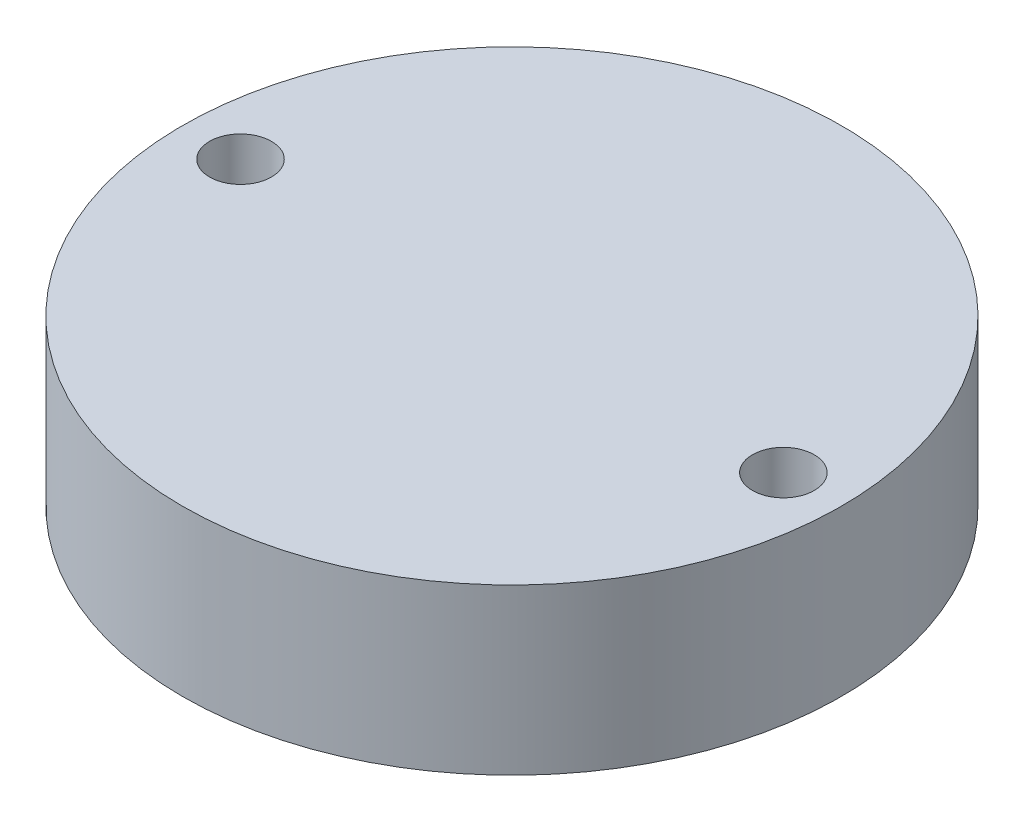
ISO-10303-21;
HEADER;
FILE_DESCRIPTION(('STEP AP214'),'2;1');
FILE_NAME('part.step','',(''),(''),'','','');
FILE_SCHEMA(('AUTOMOTIVE_DESIGN { 1 0 10303 214 1 1 1 1 }'));
ENDSEC;
DATA;
#1=APPLICATION_CONTEXT('core data for automotive mechanical design processes');
#2=APPLICATION_PROTOCOL_DEFINITION('international standard','automotive_design',2000,#1);
#3=PRODUCT_CONTEXT('',#1,'mechanical');
#4=PRODUCT('Part','Part','',(#3));
#5=PRODUCT_RELATED_PRODUCT_CATEGORY('part','',(#4));
#6=PRODUCT_DEFINITION_FORMATION('','',#4);
#7=PRODUCT_DEFINITION_CONTEXT('part definition',#1,'design');
#8=PRODUCT_DEFINITION('design','',#6,#7);
#9=PRODUCT_DEFINITION_SHAPE('','',#8);
#10=(LENGTH_UNIT() NAMED_UNIT(*) SI_UNIT(.MILLI.,.METRE.));
#11=(NAMED_UNIT(*) PLANE_ANGLE_UNIT() SI_UNIT($,.RADIAN.));
#12=(NAMED_UNIT(*) SI_UNIT($,.STERADIAN.) SOLID_ANGLE_UNIT());
#13=UNCERTAINTY_MEASURE_WITH_UNIT(LENGTH_MEASURE(1.E-05),#10,'distance_accuracy_value','');
#14=(GEOMETRIC_REPRESENTATION_CONTEXT(3) GLOBAL_UNCERTAINTY_ASSIGNED_CONTEXT((#13)) GLOBAL_UNIT_ASSIGNED_CONTEXT((#10,
#11,#12)) REPRESENTATION_CONTEXT('',''));
#15=CARTESIAN_POINT('',(0.,0.,0.));
#16=DIRECTION('',(0.,0.,1.));
#17=DIRECTION('',(1.,0.,0.));
#18=AXIS2_PLACEMENT_3D('',#15,#16,#17);
#19=CARTESIAN_POINT('',(0.,0.,0.));
#20=DIRECTION('',(0.,1.,0.));
#21=DIRECTION('',(0.,0.,1.));
#22=AXIS2_PLACEMENT_3D('',#19,#20,#21);
#23=PLANE('',#22);
#24=CARTESIAN_POINT('',(10.4595684022767,0.,0.));
#25=DIRECTION('',(0.,1.,0.));
#26=DIRECTION('',(0.,0.,1.));
#27=AXIS2_PLACEMENT_3D('',#24,#25,#26);
#28=CIRCLE('',#27,1.19310666185666);
#29=CARTESIAN_POINT('',(9.4987042014127,0.,0.707278936533995));
#30=VERTEX_POINT('',#29);
#31=CARTESIAN_POINT('',(9.4987042014127,0.,-0.707278936534003));
#32=VERTEX_POINT('',#31);
#33=EDGE_CURVE('E156',#30,#32,#28,.T.);
#34=ORIENTED_EDGE('',*,*,#33,.T.);
#35=CARTESIAN_POINT('',(0.,0.,0.));
#36=DIRECTION('',(0.,1.,0.));
#37=DIRECTION('',(0.,0.,1.));
#38=AXIS2_PLACEMENT_3D('',#35,#36,#37);
#39=CIRCLE('',#38,9.525);
#40=CARTESIAN_POINT('',(-9.49870420141271,0.,-0.707278936534003));
#41=VERTEX_POINT('',#40);
#42=EDGE_CURVE('E99',#32,#41,#39,.T.);
#43=ORIENTED_EDGE('',*,*,#42,.T.);
#44=CARTESIAN_POINT('',(-10.4595684022767,0.,0.));
#45=DIRECTION('',(0.,1.,0.));
#46=DIRECTION('',(0.,0.,1.));
#47=AXIS2_PLACEMENT_3D('',#44,#45,#46);
#48=CIRCLE('',#47,1.19310666185666);
#49=CARTESIAN_POINT('',(-9.4987042014127,0.,0.707278936533999));
#50=VERTEX_POINT('',#49);
#51=EDGE_CURVE('E84',#41,#50,#48,.T.);
#52=ORIENTED_EDGE('',*,*,#51,.T.);
#53=CARTESIAN_POINT('',(0.,0.,0.));
#54=DIRECTION('',(0.,1.,0.));
#55=DIRECTION('',(0.,0.,1.));
#56=AXIS2_PLACEMENT_3D('',#53,#54,#55);
#57=CIRCLE('',#56,9.525);
#58=EDGE_CURVE('E97',#50,#30,#57,.T.);
#59=ORIENTED_EDGE('',*,*,#58,.T.);
#60=EDGE_LOOP('',(#34,#43,#52,#59));
#61=FACE_BOUND('',#60,.T.);
#62=CARTESIAN_POINT('',(0.,0.,0.));
#63=DIRECTION('',(0.,1.,0.));
#64=DIRECTION('',(0.,0.,1.));
#65=AXIS2_PLACEMENT_3D('',#62,#63,#64);
#66=CIRCLE('',#65,12.7);
#67=CARTESIAN_POINT('',(0.,0.,12.7));
#68=VERTEX_POINT('',#67);
#69=EDGE_CURVE('E45',#68,#68,#66,.T.);
#70=ORIENTED_EDGE('',*,*,#69,.F.);
#71=EDGE_LOOP('',(#70));
#72=FACE_BOUND('',#71,.T.);
#73=ADVANCED_FACE('F41',(#61,#72),#23,.F.);
#74=CARTESIAN_POINT('',(0.,6.35,0.));
#75=DIRECTION('',(0.,-1.,0.));
#76=DIRECTION('',(0.,0.,-1.));
#77=AXIS2_PLACEMENT_3D('',#74,#75,#76);
#78=CYLINDRICAL_SURFACE('',#77,12.7);
#79=CARTESIAN_POINT('',(0.,6.35,0.));
#80=DIRECTION('',(0.,1.,0.));
#81=DIRECTION('',(0.,0.,1.));
#82=AXIS2_PLACEMENT_3D('',#79,#80,#81);
#83=CIRCLE('',#82,12.7);
#84=CARTESIAN_POINT('',(0.,6.35,12.7));
#85=VERTEX_POINT('',#84);
#86=EDGE_CURVE('E11',#85,#85,#83,.T.);
#87=ORIENTED_EDGE('',*,*,#86,.F.);
#88=EDGE_LOOP('',(#87));
#89=FACE_BOUND('',#88,.T.);
#90=ORIENTED_EDGE('',*,*,#69,.T.);
#91=EDGE_LOOP('',(#90));
#92=FACE_BOUND('',#91,.T.);
#93=ADVANCED_FACE('F43',(#89,#92),#78,.T.);
#94=CARTESIAN_POINT('',(0.,6.35,0.));
#95=DIRECTION('',(0.,1.,0.));
#96=DIRECTION('',(0.,0.,1.));
#97=AXIS2_PLACEMENT_3D('',#94,#95,#96);
#98=PLANE('',#97);
#99=CARTESIAN_POINT('',(10.4595684022767,6.35,0.));
#100=DIRECTION('',(0.,1.,0.));
#101=DIRECTION('',(0.,0.,1.));
#102=AXIS2_PLACEMENT_3D('',#99,#100,#101);
#103=CIRCLE('',#102,1.19310666185666);
#104=CARTESIAN_POINT('',(10.4595684022767,6.35,1.19310666185665));
#105=VERTEX_POINT('',#104);
#106=EDGE_CURVE('E112',#105,#105,#103,.T.);
#107=ORIENTED_EDGE('',*,*,#106,.F.);
#108=EDGE_LOOP('',(#107));
#109=FACE_BOUND('',#108,.T.);
#110=CARTESIAN_POINT('',(-10.4595684022767,6.35,0.));
#111=DIRECTION('',(0.,1.,0.));
#112=DIRECTION('',(0.,0.,1.));
#113=AXIS2_PLACEMENT_3D('',#110,#111,#112);
#114=CIRCLE('',#113,1.19310666185666);
#115=CARTESIAN_POINT('',(-10.4595684022767,6.35,1.19310666185666));
#116=VERTEX_POINT('',#115);
#117=EDGE_CURVE('E101',#116,#116,#114,.T.);
#118=ORIENTED_EDGE('',*,*,#117,.F.);
#119=EDGE_LOOP('',(#118));
#120=FACE_BOUND('',#119,.T.);
#121=ORIENTED_EDGE('',*,*,#86,.T.);
#122=EDGE_LOOP('',(#121));
#123=FACE_BOUND('',#122,.T.);
#124=ADVANCED_FACE('F132',(#109,#120,#123),#98,.T.);
#125=CARTESIAN_POINT('',(0.,3.175,0.));
#126=DIRECTION('',(0.,-1.,0.));
#127=DIRECTION('',(0.,0.,-1.));
#128=AXIS2_PLACEMENT_3D('',#125,#126,#127);
#129=CYLINDRICAL_SURFACE('',#128,9.525);
#130=ORIENTED_EDGE('',*,*,#42,.F.);
#131=DIRECTION('',(0.,-1.,0.));
#132=VECTOR('',#131,1.);
#133=CARTESIAN_POINT('',(9.4987042014127,3.175,-0.707278936534008));
#134=LINE('',#133,#132);
#135=CARTESIAN_POINT('',(9.49870420141271,3.175,-0.707278936534006));
#136=VERTEX_POINT('',#135);
#137=EDGE_CURVE('E121',#136,#32,#134,.T.);
#138=ORIENTED_EDGE('',*,*,#137,.F.);
#139=CARTESIAN_POINT('',(0.,3.175,0.));
#140=DIRECTION('',(0.,1.,0.));
#141=DIRECTION('',(0.,0.,1.));
#142=AXIS2_PLACEMENT_3D('',#139,#140,#141);
#143=CIRCLE('',#142,9.525);
#144=CARTESIAN_POINT('',(-9.4987042014127,3.175,-0.707278936534004));
#145=VERTEX_POINT('',#144);
#146=EDGE_CURVE('E110',#136,#145,#143,.T.);
#147=ORIENTED_EDGE('',*,*,#146,.T.);
#148=DIRECTION('',(0.,-1.,0.));
#149=VECTOR('',#148,1.);
#150=CARTESIAN_POINT('',(-9.4987042014127,3.175,-0.707278936534004));
#151=LINE('',#150,#149);
#152=EDGE_CURVE('E65',#145,#41,#151,.T.);
#153=ORIENTED_EDGE('',*,*,#152,.T.);
#154=EDGE_LOOP('',(#130,#138,#147,#153));
#155=FACE_BOUND('',#154,.T.);
#156=ADVANCED_FACE('F137',(#155),#129,.F.);
#157=CARTESIAN_POINT('',(0.,3.175,0.));
#158=DIRECTION('',(0.,-1.,0.));
#159=DIRECTION('',(0.,0.,-1.));
#160=AXIS2_PLACEMENT_3D('',#157,#158,#159);
#161=CYLINDRICAL_SURFACE('',#160,9.525);
#162=ORIENTED_EDGE('',*,*,#58,.F.);
#163=DIRECTION('',(0.,-1.,0.));
#164=VECTOR('',#163,1.);
#165=CARTESIAN_POINT('',(-9.4987042014127,3.175,0.707278936534004));
#166=LINE('',#165,#164);
#167=CARTESIAN_POINT('',(-9.4987042014127,3.175,0.707278936534004));
#168=VERTEX_POINT('',#167);
#169=EDGE_CURVE('E81',#168,#50,#166,.T.);
#170=ORIENTED_EDGE('',*,*,#169,.F.);
#171=CARTESIAN_POINT('',(0.,3.175,0.));
#172=DIRECTION('',(0.,1.,0.));
#173=DIRECTION('',(0.,0.,1.));
#174=AXIS2_PLACEMENT_3D('',#171,#172,#173);
#175=CIRCLE('',#174,9.525);
#176=CARTESIAN_POINT('',(9.4987042014127,3.175,0.707278936534001));
#177=VERTEX_POINT('',#176);
#178=EDGE_CURVE('E117',#168,#177,#175,.T.);
#179=ORIENTED_EDGE('',*,*,#178,.T.);
#180=DIRECTION('',(0.,-1.,0.));
#181=VECTOR('',#180,1.);
#182=CARTESIAN_POINT('',(9.4987042014127,3.175,0.707278936534001));
#183=LINE('',#182,#181);
#184=EDGE_CURVE('E57',#177,#30,#183,.T.);
#185=ORIENTED_EDGE('',*,*,#184,.T.);
#186=EDGE_LOOP('',(#162,#170,#179,#185));
#187=FACE_BOUND('',#186,.T.);
#188=ADVANCED_FACE('F103',(#187),#161,.F.);
#189=CARTESIAN_POINT('',(0.,3.175,0.));
#190=DIRECTION('',(0.,1.,0.));
#191=DIRECTION('',(0.,0.,1.));
#192=AXIS2_PLACEMENT_3D('',#189,#190,#191);
#193=PLANE('',#192);
#194=CARTESIAN_POINT('',(10.4595684022767,3.175,0.));
#195=DIRECTION('',(0.,1.,0.));
#196=DIRECTION('',(0.,0.,1.));
#197=AXIS2_PLACEMENT_3D('',#194,#195,#196);
#198=CIRCLE('',#197,1.19310666185666);
#199=EDGE_CURVE('E105',#136,#177,#198,.T.);
#200=ORIENTED_EDGE('',*,*,#199,.T.);
#201=ORIENTED_EDGE('',*,*,#178,.F.);
#202=CARTESIAN_POINT('',(-10.4595684022767,3.175,0.));
#203=DIRECTION('',(0.,1.,0.));
#204=DIRECTION('',(0.,0.,1.));
#205=AXIS2_PLACEMENT_3D('',#202,#203,#204);
#206=CIRCLE('',#205,1.19310666185666);
#207=EDGE_CURVE('E86',#168,#145,#206,.T.);
#208=ORIENTED_EDGE('',*,*,#207,.T.);
#209=ORIENTED_EDGE('',*,*,#146,.F.);
#210=EDGE_LOOP('',(#200,#201,#208,#209));
#211=FACE_BOUND('',#210,.T.);
#212=ADVANCED_FACE('F144',(#211),#193,.F.);
#213=CARTESIAN_POINT('',(-10.4595684022767,6.35,0.));
#214=DIRECTION('',(0.,-1.,0.));
#215=DIRECTION('',(0.,0.,-1.));
#216=AXIS2_PLACEMENT_3D('',#213,#214,#215);
#217=CYLINDRICAL_SURFACE('',#216,1.19310666185666);
#218=ORIENTED_EDGE('',*,*,#117,.T.);
#219=EDGE_LOOP('',(#218));
#220=FACE_BOUND('',#219,.T.);
#221=ORIENTED_EDGE('',*,*,#207,.F.);
#222=ORIENTED_EDGE('',*,*,#169,.T.);
#223=ORIENTED_EDGE('',*,*,#51,.F.);
#224=ORIENTED_EDGE('',*,*,#152,.F.);
#225=EDGE_LOOP('',(#221,#222,#223,#224));
#226=FACE_BOUND('',#225,.T.);
#227=ADVANCED_FACE('F83',(#220,#226),#217,.F.);
#228=CARTESIAN_POINT('',(10.4595684022767,6.35,0.));
#229=DIRECTION('',(0.,-1.,0.));
#230=DIRECTION('',(0.,0.,-1.));
#231=AXIS2_PLACEMENT_3D('',#228,#229,#230);
#232=CYLINDRICAL_SURFACE('',#231,1.19310666185666);
#233=ORIENTED_EDGE('',*,*,#33,.F.);
#234=ORIENTED_EDGE('',*,*,#184,.F.);
#235=ORIENTED_EDGE('',*,*,#199,.F.);
#236=ORIENTED_EDGE('',*,*,#137,.T.);
#237=EDGE_LOOP('',(#233,#234,#235,#236));
#238=FACE_BOUND('',#237,.T.);
#239=ORIENTED_EDGE('',*,*,#106,.T.);
#240=EDGE_LOOP('',(#239));
#241=FACE_BOUND('',#240,.T.);
#242=ADVANCED_FACE('F150',(#238,#241),#232,.F.);
#243=CLOSED_SHELL('',(#73,#93,#124,#156,#188,#212,#227,#242));
#244=MANIFOLD_SOLID_BREP('B2',#243);
#245=ADVANCED_BREP_SHAPE_REPRESENTATION('',(#18,#244),#14);
#246=SHAPE_DEFINITION_REPRESENTATION(#9,#245);
ENDSEC;
END-ISO-10303-21;
